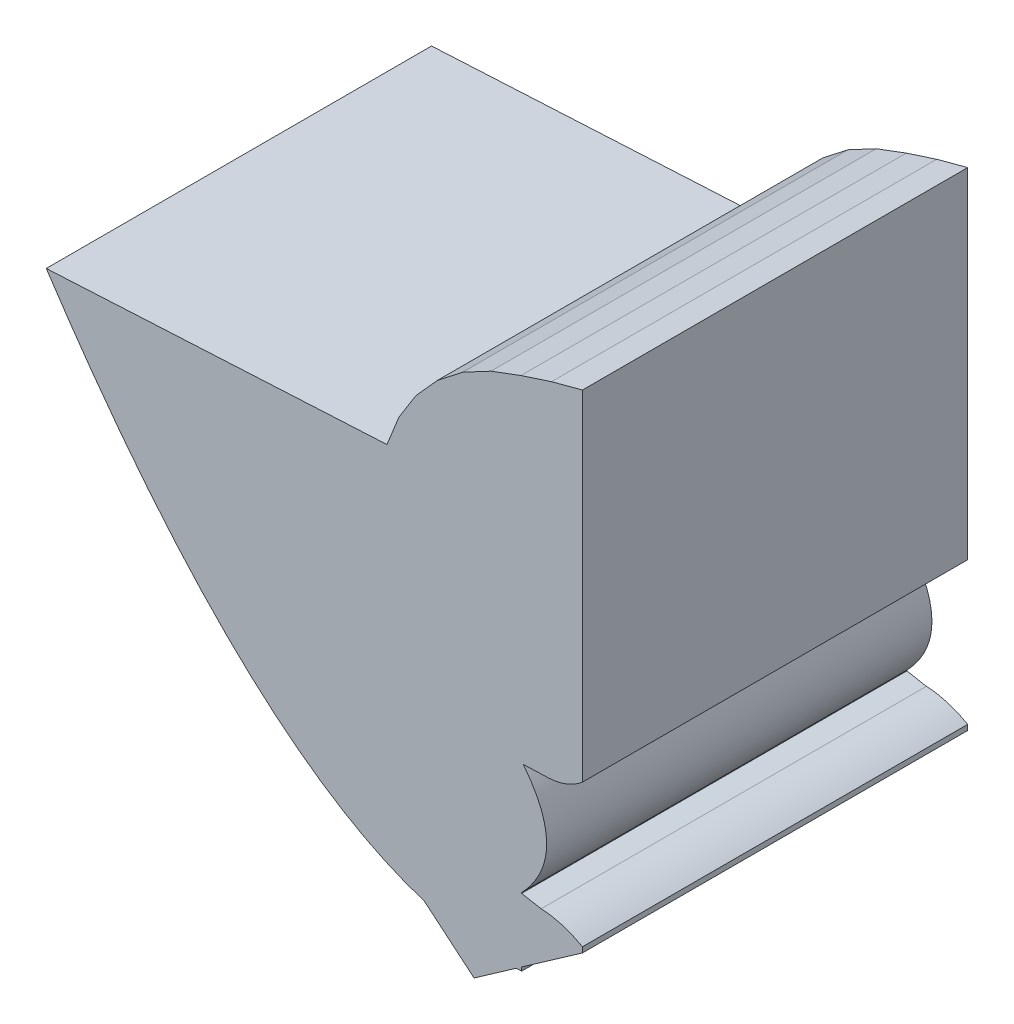
ISO-10303-21;
HEADER;
FILE_DESCRIPTION(('STEP AP214'),'2;1');
FILE_NAME('part.step','',(''),(''),'','','');
FILE_SCHEMA(('AUTOMOTIVE_DESIGN { 1 0 10303 214 1 1 1 1 }'));
ENDSEC;
DATA;
#1=APPLICATION_CONTEXT('core data for automotive mechanical design processes');
#2=APPLICATION_PROTOCOL_DEFINITION('international standard','automotive_design',2000,#1);
#3=PRODUCT_CONTEXT('',#1,'mechanical');
#4=PRODUCT('Part','Part','',(#3));
#5=PRODUCT_RELATED_PRODUCT_CATEGORY('part','',(#4));
#6=PRODUCT_DEFINITION_FORMATION('','',#4);
#7=PRODUCT_DEFINITION_CONTEXT('part definition',#1,'design');
#8=PRODUCT_DEFINITION('design','',#6,#7);
#9=PRODUCT_DEFINITION_SHAPE('','',#8);
#10=(LENGTH_UNIT() NAMED_UNIT(*) SI_UNIT(.MILLI.,.METRE.));
#11=(NAMED_UNIT(*) PLANE_ANGLE_UNIT() SI_UNIT($,.RADIAN.));
#12=(NAMED_UNIT(*) SI_UNIT($,.STERADIAN.) SOLID_ANGLE_UNIT());
#13=UNCERTAINTY_MEASURE_WITH_UNIT(LENGTH_MEASURE(1.E-05),#10,'distance_accuracy_value','');
#14=(GEOMETRIC_REPRESENTATION_CONTEXT(3) GLOBAL_UNCERTAINTY_ASSIGNED_CONTEXT((#13)) GLOBAL_UNIT_ASSIGNED_CONTEXT((#10,
#11,#12)) REPRESENTATION_CONTEXT('',''));
#15=CARTESIAN_POINT('',(0.,0.,0.));
#16=DIRECTION('',(0.,0.,1.));
#17=DIRECTION('',(1.,0.,0.));
#18=AXIS2_PLACEMENT_3D('',#15,#16,#17);
#19=CARTESIAN_POINT('',(-2.17733041778456,0.,7.21));
#20=DIRECTION('',(1.,0.,0.));
#21=DIRECTION('',(0.,1.,0.));
#22=AXIS2_PLACEMENT_3D('',#19,#20,#21);
#23=PLANE('',#22);
#24=DIRECTION('',(0.,-1.,0.));
#25=VECTOR('',#24,1.);
#26=CARTESIAN_POINT('',(-2.17733041778456,0.,7.21));
#27=LINE('',#26,#25);
#28=CARTESIAN_POINT('',(-2.17733041782181,-1.84042057234379,7.21));
#29=VERTEX_POINT('',#28);
#30=CARTESIAN_POINT('',(-2.17733041778456,-1.86563836372951,7.21));
#31=VERTEX_POINT('',#30);
#32=EDGE_CURVE('E396',#29,#31,#27,.T.);
#33=ORIENTED_EDGE('',*,*,#32,.T.);
#34=DIRECTION('',(0.,0.,-1.));
#35=VECTOR('',#34,1.);
#36=CARTESIAN_POINT('',(-2.17733041778456,-1.86563836372951,7.21));
#37=LINE('',#36,#35);
#38=CARTESIAN_POINT('',(-2.17733041778456,-1.86563836372951,-7.21));
#39=VERTEX_POINT('',#38);
#40=EDGE_CURVE('E13',#31,#39,#37,.T.);
#41=ORIENTED_EDGE('',*,*,#40,.T.);
#42=DIRECTION('',(0.,-1.,0.));
#43=VECTOR('',#42,1.);
#44=CARTESIAN_POINT('',(-2.17733041778456,0.,-7.21));
#45=LINE('',#44,#43);
#46=CARTESIAN_POINT('',(-2.17733041778456,-1.84042057230949,-7.21));
#47=VERTEX_POINT('',#46);
#48=EDGE_CURVE('E216',#47,#39,#45,.T.);
#49=ORIENTED_EDGE('',*,*,#48,.F.);
#50=DIRECTION('',(0.,0.,-1.));
#51=VECTOR('',#50,1.);
#52=CARTESIAN_POINT('',(-2.1773304177975,-1.84042057234945,31.0131303069921));
#53=LINE('',#52,#51);
#54=EDGE_CURVE('E347',#29,#47,#53,.T.);
#55=ORIENTED_EDGE('',*,*,#54,.F.);
#56=EDGE_LOOP('',(#33,#41,#49,#55));
#57=FACE_BOUND('',#56,.T.);
#58=ADVANCED_FACE('F60',(#57),#23,.T.);
#59=CARTESIAN_POINT('',(-2.17733041778456,-4.25341499115567,-7.21));
#60=VERTEX_POINT('',#59);
#61=CARTESIAN_POINT('',(-2.17733041780588,-4.38828202201243,-7.21));
#62=VERTEX_POINT('',#61);
#63=EDGE_CURVE('E336',#60,#62,#45,.T.);
#64=ORIENTED_EDGE('',*,*,#63,.F.);
#65=DIRECTION('',(0.,0.,1.));
#66=VECTOR('',#65,1.);
#67=CARTESIAN_POINT('',(-2.17733041778456,-4.25341499115567,7.21));
#68=LINE('',#67,#66);
#69=CARTESIAN_POINT('',(-2.17733041778456,-4.25341499115567,7.21));
#70=VERTEX_POINT('',#69);
#71=EDGE_CURVE('E247',#60,#70,#68,.T.);
#72=ORIENTED_EDGE('',*,*,#71,.T.);
#73=CARTESIAN_POINT('',(-2.17733041779078,-4.38828202201243,7.21));
#74=VERTEX_POINT('',#73);
#75=EDGE_CURVE('E398',#70,#74,#27,.T.);
#76=ORIENTED_EDGE('',*,*,#75,.T.);
#77=DIRECTION('',(0.,0.,1.));
#78=VECTOR('',#77,1.);
#79=CARTESIAN_POINT('',(-2.17733041780588,-4.38828202201243,-7.21));
#80=LINE('',#79,#78);
#81=EDGE_CURVE('E309',#62,#74,#80,.T.);
#82=ORIENTED_EDGE('',*,*,#81,.F.);
#83=EDGE_LOOP('',(#64,#72,#76,#82));
#84=FACE_BOUND('',#83,.T.);
#85=ADVANCED_FACE('F367',(#84),#23,.T.);
#86=CARTESIAN_POINT('',(-82931.2998220372,996560.090302793,31.0131303069921));
#87=CARTESIAN_POINT('',(87153.6895148631,-996199.076380996,31.0131303069921));
#88=CARTESIAN_POINT('',(-91384.2921388704,995820.549302198,31.0131303069921));
#89=B_SPLINE_CURVE_WITH_KNOTS('',2,(#86,#87,#88),.UNSPECIFIED.,.F.,.F.,(3,3),(0.,1.),.UNSPECIFIED.);
#90=DIRECTION('',(0.,0.,-1.));
#91=VECTOR('',#90,1.);
#92=SURFACE_OF_LINEAR_EXTRUSION('',#89,#91);
#93=CARTESIAN_POINT('',(-82931.2998220372,996560.090302793,-7.21));
#94=CARTESIAN_POINT('',(87153.6895148631,-996199.076380996,-7.21));
#95=CARTESIAN_POINT('',(-91384.2921388704,995820.549302198,-7.21));
#96=B_SPLINE_CURVE_WITH_KNOTS('',2,(#93,#94,#95),.UNSPECIFIED.,.F.,.F.,(3,3),(0.,1.),.UNSPECIFIED.);
#97=CARTESIAN_POINT('',(-19.969359013593,9.49376503209276,-7.21));
#98=VERTEX_POINT('',#97);
#99=CARTESIAN_POINT('',(-5.81761685091845,-3.9392926951686,-7.21));
#100=VERTEX_POINT('',#99);
#101=EDGE_CURVE('E323',#98,#100,#96,.F.);
#102=ORIENTED_EDGE('',*,*,#101,.T.);
#103=DIRECTION('',(0.,0.,-1.));
#104=VECTOR('',#103,1.);
#105=CARTESIAN_POINT('',(-5.8176168506292,-3.939292695462,0.));
#106=LINE('',#105,#104);
#107=CARTESIAN_POINT('',(-5.81761685090827,-3.93929269517714,7.21));
#108=VERTEX_POINT('',#107);
#109=EDGE_CURVE('E64',#100,#108,#106,.F.);
#110=ORIENTED_EDGE('',*,*,#109,.T.);
#111=CARTESIAN_POINT('',(-82931.2998220372,996560.090302793,7.21));
#112=CARTESIAN_POINT('',(87153.6895148631,-996199.076380996,7.21));
#113=CARTESIAN_POINT('',(-91384.2921388704,995820.549302198,7.21));
#114=B_SPLINE_CURVE_WITH_KNOTS('',2,(#111,#112,#113),.UNSPECIFIED.,.F.,.F.,(3,3),(0.,1.),.UNSPECIFIED.);
#115=CARTESIAN_POINT('',(-19.969359013593,9.49376503209276,7.21));
#116=VERTEX_POINT('',#115);
#117=EDGE_CURVE('E339',#108,#116,#114,.T.);
#118=ORIENTED_EDGE('',*,*,#117,.T.);
#119=DIRECTION('',(0.,0.,1.));
#120=VECTOR('',#119,1.);
#121=CARTESIAN_POINT('',(-19.969359013593,9.49376503209276,-7.21));
#122=LINE('',#121,#120);
#123=EDGE_CURVE('E307',#98,#116,#122,.T.);
#124=ORIENTED_EDGE('',*,*,#123,.F.);
#125=EDGE_LOOP('',(#102,#110,#118,#124));
#126=FACE_BOUND('',#125,.T.);
#127=ADVANCED_FACE('F364',(#126),#92,.T.);
#128=CARTESIAN_POINT('',(-2.38857363558244,-4.40132908465364,7.21));
#129=VERTEX_POINT('',#128);
#130=EDGE_CURVE('E327',#74,#129,#114,.T.);
#131=ORIENTED_EDGE('',*,*,#130,.T.);
#132=DIRECTION('',(0.,0.,-1.));
#133=VECTOR('',#132,1.);
#134=CARTESIAN_POINT('',(-2.38857363570211,-4.4013290847312,0.));
#135=LINE('',#134,#133);
#136=CARTESIAN_POINT('',(-2.38857363552891,-4.40132908473009,-7.21));
#137=VERTEX_POINT('',#136);
#138=EDGE_CURVE('E402',#129,#137,#135,.T.);
#139=ORIENTED_EDGE('',*,*,#138,.T.);
#140=EDGE_CURVE('E318',#137,#62,#96,.F.);
#141=ORIENTED_EDGE('',*,*,#140,.T.);
#142=ORIENTED_EDGE('',*,*,#81,.T.);
#143=EDGE_LOOP('',(#131,#139,#141,#142));
#144=FACE_BOUND('',#143,.T.);
#145=ADVANCED_FACE('F368',(#144),#92,.T.);
#146=CARTESIAN_POINT('',(-996004.99942647,89338.2959789018,31.0131303069921));
#147=CARTESIAN_POINT('',(996193.448091746,-87155.7427476542,31.0131303069921));
#148=CARTESIAN_POINT('',(-996386.896757022,84973.1895164066,31.0131303069921));
#149=B_SPLINE_CURVE_WITH_KNOTS('',2,(#146,#147,#148),.UNSPECIFIED.,.F.,.F.,(3,3),(0.,1.),.UNSPECIFIED.);
#150=DIRECTION('',(0.,0.,-1.));
#151=VECTOR('',#150,1.);
#152=SURFACE_OF_LINEAR_EXTRUSION('',#149,#151);
#153=CARTESIAN_POINT('',(-996004.99942647,89338.2959789018,-7.21));
#154=CARTESIAN_POINT('',(996193.448091746,-87155.7427476542,-7.21));
#155=CARTESIAN_POINT('',(-996386.896757022,84973.1895164066,-7.21));
#156=B_SPLINE_CURVE_WITH_KNOTS('',2,(#153,#154,#155),.UNSPECIFIED.,.F.,.F.,(3,3),(0.,1.),.UNSPECIFIED.);
#157=CARTESIAN_POINT('',(-2.11351559802847,2.34471546976612,-7.21));
#158=VERTEX_POINT('',#157);
#159=EDGE_CURVE('E312',#47,#158,#156,.F.);
#160=ORIENTED_EDGE('',*,*,#159,.T.);
#161=DIRECTION('',(0.,0.,-1.));
#162=VECTOR('',#161,1.);
#163=CARTESIAN_POINT('',(-2.11351560817419,2.34471546941195,0.));
#164=LINE('',#163,#162);
#165=CARTESIAN_POINT('',(-2.11351559755463,2.34471545592907,7.21));
#166=VERTEX_POINT('',#165);
#167=EDGE_CURVE('E397',#158,#166,#164,.F.);
#168=ORIENTED_EDGE('',*,*,#167,.T.);
#169=CARTESIAN_POINT('',(-996004.99942647,89338.2959789018,7.21));
#170=CARTESIAN_POINT('',(996193.448091746,-87155.7427476542,7.21));
#171=CARTESIAN_POINT('',(-996386.896757022,84973.1895164066,7.21));
#172=B_SPLINE_CURVE_WITH_KNOTS('',2,(#169,#170,#171),.UNSPECIFIED.,.F.,.F.,(3,3),(0.,1.),.UNSPECIFIED.);
#173=EDGE_CURVE('E328',#166,#29,#172,.T.);
#174=ORIENTED_EDGE('',*,*,#173,.T.);
#175=ORIENTED_EDGE('',*,*,#54,.T.);
#176=EDGE_LOOP('',(#160,#168,#174,#175));
#177=FACE_BOUND('',#176,.T.);
#178=ADVANCED_FACE('F373',(#177),#152,.T.);
#179=CARTESIAN_POINT('',(0.,0.,7.21));
#180=DIRECTION('',(0.,0.,1.));
#181=DIRECTION('',(1.,0.,0.));
#182=AXIS2_PLACEMENT_3D('',#179,#180,#181);
#183=PLANE('',#182);
#184=ORIENTED_EDGE('',*,*,#75,.F.);
#185=DIRECTION('',(0.819152044288593,0.573576436351615,0.));
#186=VECTOR('',#185,1.);
#187=CARTESIAN_POINT('',(0.100000000004221,-2.65881106562334,7.21));
#188=LINE('',#187,#186);
#189=CARTESIAN_POINT('',(0.100000000004221,-2.65881106562334,7.21));
#190=VERTEX_POINT('',#189);
#191=EDGE_CURVE('E71',#70,#190,#188,.T.);
#192=ORIENTED_EDGE('',*,*,#191,.T.);
#193=DIRECTION('',(-1.62011653008151E-11,1.,0.));
#194=VECTOR('',#193,1.);
#195=CARTESIAN_POINT('',(0.100000000000981,-2.45881106562334,7.21));
#196=LINE('',#195,#194);
#197=CARTESIAN_POINT('',(0.100000000000981,-2.45881106562334,7.21));
#198=VERTEX_POINT('',#197);
#199=EDGE_CURVE('E258',#190,#198,#196,.T.);
#200=ORIENTED_EDGE('',*,*,#199,.T.);
#201=CARTESIAN_POINT('',(-15004.7897636461,-999892.444646946,7.21));
#202=CARTESIAN_POINT('',(17450.906437277,999845.695156391,7.21));
#203=CARTESIAN_POINT('',(-19903.023110908,-999806.945665836,7.21));
#204=B_SPLINE_CURVE_WITH_KNOTS('',2,(#201,#202,#203),.UNSPECIFIED.,.F.,.F.,(3,3),(0.,1.),.UNSPECIFIED.);
#205=CARTESIAN_POINT('',(-1.44765075676889,-2.00137084805176,7.21));
#206=VERTEX_POINT('',#205);
#207=EDGE_CURVE('E255',#198,#206,#204,.T.);
#208=ORIENTED_EDGE('',*,*,#207,.T.);
#209=DIRECTION('',(-0.983135348114243,0.182879433748812,0.));
#210=VECTOR('',#209,1.);
#211=CARTESIAN_POINT('',(-1.44765075676889,-2.00137084805176,7.21));
#212=LINE('',#211,#210);
#213=EDGE_CURVE('E227',#206,#31,#212,.T.);
#214=ORIENTED_EDGE('',*,*,#213,.T.);
#215=ORIENTED_EDGE('',*,*,#32,.F.);
#216=ORIENTED_EDGE('',*,*,#173,.F.);
#217=DIRECTION('',(0.999390827019096,0.0348994967025048,0.));
#218=VECTOR('',#217,1.);
#219=CARTESIAN_POINT('',(-2.17733041778456,2.34248700715526,7.21));
#220=LINE('',#219,#218);
#221=CARTESIAN_POINT('',(-1.19050164048462,2.37694782742692,7.21000000000002));
#222=VERTEX_POINT('',#221);
#223=EDGE_CURVE('E501',#166,#222,#220,.T.);
#224=ORIENTED_EDGE('',*,*,#223,.T.);
#225=CARTESIAN_POINT('',(-343900.072311573,939011.080499257,7.21000000000001));
#226=CARTESIAN_POINT('',(342019.599581338,-939690.120785908,7.21000000000001));
#227=CARTESIAN_POINT('',(-340141.301828429,940379.16107256,7.21000000000001));
#228=B_SPLINE_CURVE_WITH_KNOTS('',2,(#225,#226,#227),.UNSPECIFIED.,.F.,.F.,(3,3),(0.,1.),.UNSPECIFIED.);
#229=CARTESIAN_POINT('',(0.100000000004221,2.87767341815847,7.21000000000001));
#230=VERTEX_POINT('',#229);
#231=EDGE_CURVE('E306',#222,#230,#228,.T.);
#232=ORIENTED_EDGE('',*,*,#231,.T.);
#233=DIRECTION('',(0.,1.,0.));
#234=VECTOR('',#233,1.);
#235=CARTESIAN_POINT('',(0.100000000004221,2.87767341815847,7.21));
#236=LINE('',#235,#234);
#237=CARTESIAN_POINT('',(0.100000000004747,15.587903347272,7.21));
#238=VERTEX_POINT('',#237);
#239=EDGE_CURVE('E433',#230,#238,#236,.T.);
#240=ORIENTED_EDGE('',*,*,#239,.T.);
#241=DIRECTION('',(-0.96592582628907,-0.258819045102515,0.));
#242=VECTOR('',#241,1.);
#243=CARTESIAN_POINT('',(-1.05911099154214,15.277320493149,7.21));
#244=LINE('',#243,#242);
#245=CARTESIAN_POINT('',(-1.05911099154214,15.277320493149,7.21000000000001));
#246=VERTEX_POINT('',#245);
#247=EDGE_CURVE('E438',#238,#246,#244,.T.);
#248=ORIENTED_EDGE('',*,*,#247,.T.);
#249=DIRECTION('',(-0.951056516295155,-0.309016994374943,0.));
#250=VECTOR('',#249,1.);
#251=CARTESIAN_POINT('',(-2.20037881109632,14.906500099899,7.21));
#252=LINE('',#251,#250);
#253=CARTESIAN_POINT('',(-2.20037881109632,14.906500099899,7.21000000000001));
#254=VERTEX_POINT('',#253);
#255=EDGE_CURVE('E445',#246,#254,#252,.T.);
#256=ORIENTED_EDGE('',*,*,#255,.T.);
#257=DIRECTION('',(-0.9366721892484,-0.350207381259461,0.));
#258=VECTOR('',#257,1.);
#259=CARTESIAN_POINT('',(-3.3243854381944,14.4862512423877,7.21));
#260=LINE('',#259,#258);
#261=CARTESIAN_POINT('',(-3.3243854381944,14.4862512423877,7.21000000000001));
#262=VERTEX_POINT('',#261);
#263=EDGE_CURVE('E518',#254,#262,#260,.T.);
#264=ORIENTED_EDGE('',*,*,#263,.T.);
#265=DIRECTION('',(-0.882947592859007,-0.46947156278574,0.));
#266=VECTOR('',#265,1.);
#267=CARTESIAN_POINT('',(-4.38392254962521,13.9228853670448,7.21));
#268=LINE('',#267,#266);
#269=CARTESIAN_POINT('',(-4.38392254962521,13.9228853670448,7.21000000000001));
#270=VERTEX_POINT('',#269);
#271=EDGE_CURVE('E514',#262,#270,#268,.T.);
#272=ORIENTED_EDGE('',*,*,#271,.T.);
#273=DIRECTION('',(-0.788010753606726,-0.615661475325654,0.));
#274=VECTOR('',#273,1.);
#275=CARTESIAN_POINT('',(-5.32953545395328,13.184091596654,7.21));
#276=LINE('',#275,#274);
#277=CARTESIAN_POINT('',(-5.32953545395328,13.184091596654,7.21000000000001));
#278=VERTEX_POINT('',#277);
#279=EDGE_CURVE('E509',#270,#278,#276,.T.);
#280=ORIENTED_EDGE('',*,*,#279,.T.);
#281=DIRECTION('',(-0.669130606358526,-0.743144825477694,0.));
#282=VECTOR('',#281,1.);
#283=CARTESIAN_POINT('',(-6.13249218158351,12.2923178060808,7.21));
#284=LINE('',#283,#282);
#285=CARTESIAN_POINT('',(-6.13249218158351,12.2923178060808,7.21000000000001));
#286=VERTEX_POINT('',#285);
#287=EDGE_CURVE('E507',#278,#286,#284,.T.);
#288=ORIENTED_EDGE('',*,*,#287,.T.);
#289=DIRECTION('',(-0.52991926423321,-0.848048096156423,0.));
#290=VECTOR('',#289,1.);
#291=CARTESIAN_POINT('',(-6.76839529866336,11.2746600906931,7.21));
#292=LINE('',#291,#290);
#293=CARTESIAN_POINT('',(-6.76839529866336,11.2746600906931,7.21000000000001));
#294=VERTEX_POINT('',#293);
#295=EDGE_CURVE('E461',#286,#294,#292,.T.);
#296=ORIENTED_EDGE('',*,*,#295,.T.);
#297=DIRECTION('',(-0.374606593415918,-0.927183854566785,0.));
#298=VECTOR('',#297,1.);
#299=CARTESIAN_POINT('',(-7.21792321076246,10.1620394652129,7.21));
#300=LINE('',#299,#298);
#301=CARTESIAN_POINT('',(-7.21792321076246,10.1620394652129,7.21000000000001));
#302=VERTEX_POINT('',#301);
#303=EDGE_CURVE('E413',#294,#302,#300,.T.);
#304=ORIENTED_EDGE('',*,*,#303,.T.);
#305=DIRECTION('',(-0.998629534754472,-0.0523359562448839,0.));
#306=VECTOR('',#305,1.);
#307=CARTESIAN_POINT('',(-19.969359013593,9.49376503209276,7.21));
#308=LINE('',#307,#306);
#309=EDGE_CURVE('E299',#302,#116,#308,.T.);
#310=ORIENTED_EDGE('',*,*,#309,.T.);
#311=ORIENTED_EDGE('',*,*,#117,.F.);
#312=DIRECTION('',(0.766044443118984,-0.642787609686532,0.));
#313=VECTOR('',#312,1.);
#314=CARTESIAN_POINT('',(-10.029650264515,-0.404977011313413,7.21));
#315=LINE('',#314,#313);
#316=CARTESIAN_POINT('',(-3.95763831339756,-5.5,7.21));
#317=VERTEX_POINT('',#316);
#318=EDGE_CURVE('E248',#108,#317,#315,.T.);
#319=ORIENTED_EDGE('',*,*,#318,.T.);
#320=EDGE_CURVE('E244',#317,#129,#188,.T.);
#321=ORIENTED_EDGE('',*,*,#320,.T.);
#322=ORIENTED_EDGE('',*,*,#130,.F.);
#323=EDGE_LOOP('',(#184,#192,#200,#208,#214,#215,#216,#224,#232,#240,#248,#256,#264,#272,#280,
#288,#296,#304,#310,#311,#319,#321,#322));
#324=FACE_BOUND('',#323,.T.);
#325=ADVANCED_FACE('F376',(#324),#183,.T.);
#326=CARTESIAN_POINT('',(0.,0.,-7.21));
#327=DIRECTION('',(0.,0.,1.));
#328=DIRECTION('',(1.,0.,0.));
#329=AXIS2_PLACEMENT_3D('',#326,#327,#328);
#330=PLANE('',#329);
#331=ORIENTED_EDGE('',*,*,#48,.T.);
#332=DIRECTION('',(0.983135348114243,-0.182879433748812,0.));
#333=VECTOR('',#332,1.);
#334=CARTESIAN_POINT('',(-1.44765075676889,-2.00137084805176,-7.21));
#335=LINE('',#334,#333);
#336=CARTESIAN_POINT('',(-1.44765075676889,-2.00137084805176,-7.21));
#337=VERTEX_POINT('',#336);
#338=EDGE_CURVE('E213',#39,#337,#335,.T.);
#339=ORIENTED_EDGE('',*,*,#338,.T.);
#340=CARTESIAN_POINT('',(-15004.7897636461,-999892.444646946,-7.21));
#341=CARTESIAN_POINT('',(17450.906437277,999845.695156391,-7.21));
#342=CARTESIAN_POINT('',(-19903.023110908,-999806.945665836,-7.21));
#343=B_SPLINE_CURVE_WITH_KNOTS('',2,(#340,#341,#342),.UNSPECIFIED.,.F.,.F.,(3,3),(0.,1.),.UNSPECIFIED.);
#344=CARTESIAN_POINT('',(0.100000000000981,-2.45881106562334,-7.21));
#345=VERTEX_POINT('',#344);
#346=EDGE_CURVE('E217',#337,#345,#343,.F.);
#347=ORIENTED_EDGE('',*,*,#346,.T.);
#348=DIRECTION('',(1.62011653008151E-11,-1.,0.));
#349=VECTOR('',#348,1.);
#350=CARTESIAN_POINT('',(0.100000000000981,-2.45881106562334,-7.21));
#351=LINE('',#350,#349);
#352=CARTESIAN_POINT('',(0.100000000004221,-2.65881106562334,-7.21));
#353=VERTEX_POINT('',#352);
#354=EDGE_CURVE('E234',#345,#353,#351,.T.);
#355=ORIENTED_EDGE('',*,*,#354,.T.);
#356=DIRECTION('',(-0.819152044288593,-0.573576436351615,0.));
#357=VECTOR('',#356,1.);
#358=CARTESIAN_POINT('',(0.100000000004221,-2.65881106562334,-7.21));
#359=LINE('',#358,#357);
#360=EDGE_CURVE('E236',#353,#60,#359,.T.);
#361=ORIENTED_EDGE('',*,*,#360,.T.);
#362=ORIENTED_EDGE('',*,*,#63,.T.);
#363=ORIENTED_EDGE('',*,*,#140,.F.);
#364=CARTESIAN_POINT('',(-3.95763831339756,-5.5,-7.21));
#365=VERTEX_POINT('',#364);
#366=EDGE_CURVE('E79',#137,#365,#359,.T.);
#367=ORIENTED_EDGE('',*,*,#366,.T.);
#368=DIRECTION('',(-0.766044443118984,0.642787609686532,0.));
#369=VECTOR('',#368,1.);
#370=CARTESIAN_POINT('',(-10.029650264515,-0.404977011313413,-7.21));
#371=LINE('',#370,#369);
#372=EDGE_CURVE('E709',#365,#100,#371,.T.);
#373=ORIENTED_EDGE('',*,*,#372,.T.);
#374=ORIENTED_EDGE('',*,*,#101,.F.);
#375=DIRECTION('',(-0.998629534754472,-0.0523359562448839,0.));
#376=VECTOR('',#375,1.);
#377=CARTESIAN_POINT('',(-19.969359013593,9.49376503209276,-7.21));
#378=LINE('',#377,#376);
#379=CARTESIAN_POINT('',(-7.21792321076246,10.1620394652129,-7.21));
#380=VERTEX_POINT('',#379);
#381=EDGE_CURVE('E304',#380,#98,#378,.T.);
#382=ORIENTED_EDGE('',*,*,#381,.F.);
#383=DIRECTION('',(0.374606593415918,0.927183854566785,0.));
#384=VECTOR('',#383,1.);
#385=CARTESIAN_POINT('',(-7.21792321076246,10.1620394652129,-7.21));
#386=LINE('',#385,#384);
#387=CARTESIAN_POINT('',(-6.76839529866336,11.2746600906931,-7.21));
#388=VERTEX_POINT('',#387);
#389=EDGE_CURVE('E425',#380,#388,#386,.T.);
#390=ORIENTED_EDGE('',*,*,#389,.T.);
#391=DIRECTION('',(0.52991926423321,0.848048096156423,0.));
#392=VECTOR('',#391,1.);
#393=CARTESIAN_POINT('',(-6.76839529866336,11.2746600906931,-7.21));
#394=LINE('',#393,#392);
#395=CARTESIAN_POINT('',(-6.13249218158351,12.2923178060808,-7.21));
#396=VERTEX_POINT('',#395);
#397=EDGE_CURVE('E457',#388,#396,#394,.T.);
#398=ORIENTED_EDGE('',*,*,#397,.T.);
#399=DIRECTION('',(0.669130606358526,0.743144825477694,0.));
#400=VECTOR('',#399,1.);
#401=CARTESIAN_POINT('',(-6.13249218158351,12.2923178060808,-7.21));
#402=LINE('',#401,#400);
#403=CARTESIAN_POINT('',(-5.32953545395328,13.184091596654,-7.21));
#404=VERTEX_POINT('',#403);
#405=EDGE_CURVE('E470',#396,#404,#402,.T.);
#406=ORIENTED_EDGE('',*,*,#405,.T.);
#407=DIRECTION('',(0.788010753606726,0.615661475325654,0.));
#408=VECTOR('',#407,1.);
#409=CARTESIAN_POINT('',(-5.32953545395328,13.184091596654,-7.21));
#410=LINE('',#409,#408);
#411=CARTESIAN_POINT('',(-4.38392254962521,13.9228853670448,-7.21));
#412=VERTEX_POINT('',#411);
#413=EDGE_CURVE('E475',#404,#412,#410,.T.);
#414=ORIENTED_EDGE('',*,*,#413,.T.);
#415=DIRECTION('',(0.882947592859007,0.46947156278574,0.));
#416=VECTOR('',#415,1.);
#417=CARTESIAN_POINT('',(-4.38392254962521,13.9228853670448,-7.21));
#418=LINE('',#417,#416);
#419=CARTESIAN_POINT('',(-3.3243854381944,14.4862512423877,-7.21));
#420=VERTEX_POINT('',#419);
#421=EDGE_CURVE('E474',#412,#420,#418,.T.);
#422=ORIENTED_EDGE('',*,*,#421,.T.);
#423=DIRECTION('',(0.9366721892484,0.350207381259461,0.));
#424=VECTOR('',#423,1.);
#425=CARTESIAN_POINT('',(-3.3243854381944,14.4862512423877,-7.21));
#426=LINE('',#425,#424);
#427=CARTESIAN_POINT('',(-2.20037881109632,14.906500099899,-7.21000000000001));
#428=VERTEX_POINT('',#427);
#429=EDGE_CURVE('E714',#420,#428,#426,.T.);
#430=ORIENTED_EDGE('',*,*,#429,.T.);
#431=DIRECTION('',(0.951056516295155,0.309016994374943,0.));
#432=VECTOR('',#431,1.);
#433=CARTESIAN_POINT('',(-2.20037881109632,14.906500099899,-7.21));
#434=LINE('',#433,#432);
#435=CARTESIAN_POINT('',(-1.05911099154214,15.277320493149,-7.21));
#436=VERTEX_POINT('',#435);
#437=EDGE_CURVE('E492',#428,#436,#434,.T.);
#438=ORIENTED_EDGE('',*,*,#437,.T.);
#439=DIRECTION('',(0.96592582628907,0.258819045102515,0.));
#440=VECTOR('',#439,1.);
#441=CARTESIAN_POINT('',(-1.05911099154214,15.277320493149,-7.21));
#442=LINE('',#441,#440);
#443=CARTESIAN_POINT('',(0.100000000004747,15.587903347272,-7.21));
#444=VERTEX_POINT('',#443);
#445=EDGE_CURVE('E495',#436,#444,#442,.T.);
#446=ORIENTED_EDGE('',*,*,#445,.T.);
#447=DIRECTION('',(0.,-1.,0.));
#448=VECTOR('',#447,1.);
#449=CARTESIAN_POINT('',(0.100000000004221,2.87767341815847,-7.21));
#450=LINE('',#449,#448);
#451=CARTESIAN_POINT('',(0.0999999999995449,2.8776734181557,-7.21000000000001));
#452=VERTEX_POINT('',#451);
#453=EDGE_CURVE('E487',#444,#452,#450,.T.);
#454=ORIENTED_EDGE('',*,*,#453,.T.);
#455=CARTESIAN_POINT('',(-343900.072311573,939011.080499257,-7.21000000000001));
#456=CARTESIAN_POINT('',(342019.599581338,-939690.120785908,-7.21000000000001));
#457=CARTESIAN_POINT('',(-340141.301828429,940379.16107256,-7.21000000000001));
#458=B_SPLINE_CURVE_WITH_KNOTS('',2,(#455,#456,#457),.UNSPECIFIED.,.F.,.F.,(3,3),(0.,1.),.UNSPECIFIED.);
#459=CARTESIAN_POINT('',(-1.19050164048462,2.37694782741517,-7.21));
#460=VERTEX_POINT('',#459);
#461=EDGE_CURVE('E484',#452,#460,#458,.F.);
#462=ORIENTED_EDGE('',*,*,#461,.T.);
#463=DIRECTION('',(-0.999390827019096,-0.0348994967025048,0.));
#464=VECTOR('',#463,1.);
#465=CARTESIAN_POINT('',(-2.17733041778456,2.34248700715526,-7.21));
#466=LINE('',#465,#464);
#467=EDGE_CURVE('E476',#460,#158,#466,.T.);
#468=ORIENTED_EDGE('',*,*,#467,.T.);
#469=ORIENTED_EDGE('',*,*,#159,.F.);
#470=EDGE_LOOP('',(#331,#339,#347,#355,#361,#362,#363,#367,#373,#374,#382,#390,#398,#406,#414,
#422,#430,#438,#446,#454,#462,#468,#469));
#471=FACE_BOUND('',#470,.T.);
#472=ADVANCED_FACE('F211',(#471),#330,.F.);
#473=CARTESIAN_POINT('',(-19.969359013593,9.49376503209276,-7.21));
#474=DIRECTION('',(-0.0523359562448839,0.998629534754472,0.));
#475=DIRECTION('',(-0.998629534754472,-0.0523359562448839,0.));
#476=AXIS2_PLACEMENT_3D('',#473,#474,#475);
#477=PLANE('',#476);
#478=ORIENTED_EDGE('',*,*,#309,.F.);
#479=DIRECTION('',(0.,0.,-1.));
#480=VECTOR('',#479,1.);
#481=CARTESIAN_POINT('',(-7.21792321076246,10.1620394652129,24.0565253000013));
#482=LINE('',#481,#480);
#483=EDGE_CURVE('E417',#302,#380,#482,.T.);
#484=ORIENTED_EDGE('',*,*,#483,.T.);
#485=ORIENTED_EDGE('',*,*,#381,.T.);
#486=ORIENTED_EDGE('',*,*,#123,.T.);
#487=EDGE_LOOP('',(#478,#484,#485,#486));
#488=FACE_BOUND('',#487,.T.);
#489=ADVANCED_FACE('F371',(#488),#477,.T.);
#490=CARTESIAN_POINT('',(-1.05911099154214,15.277320493149,24.0565253000013));
#491=DIRECTION('',(0.258819045102515,-0.96592582628907,0.));
#492=DIRECTION('',(0.96592582628907,0.258819045102515,0.));
#493=AXIS2_PLACEMENT_3D('',#490,#491,#492);
#494=PLANE('',#493);
#495=ORIENTED_EDGE('',*,*,#247,.F.);
#496=DIRECTION('',(0.,0.,-1.));
#497=VECTOR('',#496,1.);
#498=CARTESIAN_POINT('',(0.100000000004747,15.587903347272,24.0565253000013));
#499=LINE('',#498,#497);
#500=EDGE_CURVE('E300',#238,#444,#499,.T.);
#501=ORIENTED_EDGE('',*,*,#500,.T.);
#502=ORIENTED_EDGE('',*,*,#445,.F.);
#503=DIRECTION('',(0.,0.,-1.));
#504=VECTOR('',#503,1.);
#505=CARTESIAN_POINT('',(-1.05911099154214,15.277320493149,24.0565253000013));
#506=LINE('',#505,#504);
#507=EDGE_CURVE('E447',#246,#436,#506,.T.);
#508=ORIENTED_EDGE('',*,*,#507,.F.);
#509=EDGE_LOOP('',(#495,#501,#502,#508));
#510=FACE_BOUND('',#509,.T.);
#511=ADVANCED_FACE('F383',(#510),#494,.F.);
#512=CARTESIAN_POINT('',(-2.20037881109632,14.906500099899,24.0565253000013));
#513=DIRECTION('',(0.309016994374943,-0.951056516295155,0.));
#514=DIRECTION('',(0.951056516295155,0.309016994374943,0.));
#515=AXIS2_PLACEMENT_3D('',#512,#513,#514);
#516=PLANE('',#515);
#517=ORIENTED_EDGE('',*,*,#255,.F.);
#518=ORIENTED_EDGE('',*,*,#507,.T.);
#519=ORIENTED_EDGE('',*,*,#437,.F.);
#520=DIRECTION('',(0.,0.,-1.));
#521=VECTOR('',#520,1.);
#522=CARTESIAN_POINT('',(-2.20037881109632,14.906500099899,24.0565253000013));
#523=LINE('',#522,#521);
#524=EDGE_CURVE('E449',#254,#428,#523,.T.);
#525=ORIENTED_EDGE('',*,*,#524,.F.);
#526=EDGE_LOOP('',(#517,#518,#519,#525));
#527=FACE_BOUND('',#526,.T.);
#528=ADVANCED_FACE('F525',(#527),#516,.F.);
#529=CARTESIAN_POINT('',(-3.3243854381944,14.4862512423877,24.0565253000013));
#530=DIRECTION('',(0.350207381259461,-0.9366721892484,0.));
#531=DIRECTION('',(0.9366721892484,0.350207381259461,0.));
#532=AXIS2_PLACEMENT_3D('',#529,#530,#531);
#533=PLANE('',#532);
#534=ORIENTED_EDGE('',*,*,#263,.F.);
#535=ORIENTED_EDGE('',*,*,#524,.T.);
#536=ORIENTED_EDGE('',*,*,#429,.F.);
#537=DIRECTION('',(0.,0.,-1.));
#538=VECTOR('',#537,1.);
#539=CARTESIAN_POINT('',(-3.3243854381944,14.4862512423877,24.0565253000013));
#540=LINE('',#539,#538);
#541=EDGE_CURVE('E448',#262,#420,#540,.T.);
#542=ORIENTED_EDGE('',*,*,#541,.F.);
#543=EDGE_LOOP('',(#534,#535,#536,#542));
#544=FACE_BOUND('',#543,.T.);
#545=ADVANCED_FACE('F553',(#544),#533,.F.);
#546=CARTESIAN_POINT('',(-4.38392254962521,13.9228853670448,24.0565253000013));
#547=DIRECTION('',(0.46947156278574,-0.882947592859007,0.));
#548=DIRECTION('',(0.882947592859007,0.46947156278574,0.));
#549=AXIS2_PLACEMENT_3D('',#546,#547,#548);
#550=PLANE('',#549);
#551=ORIENTED_EDGE('',*,*,#271,.F.);
#552=ORIENTED_EDGE('',*,*,#541,.T.);
#553=ORIENTED_EDGE('',*,*,#421,.F.);
#554=DIRECTION('',(0.,0.,-1.));
#555=VECTOR('',#554,1.);
#556=CARTESIAN_POINT('',(-4.38392254962521,13.9228853670448,24.0565253000013));
#557=LINE('',#556,#555);
#558=EDGE_CURVE('E455',#270,#412,#557,.T.);
#559=ORIENTED_EDGE('',*,*,#558,.F.);
#560=EDGE_LOOP('',(#551,#552,#553,#559));
#561=FACE_BOUND('',#560,.T.);
#562=ADVANCED_FACE('F549',(#561),#550,.F.);
#563=CARTESIAN_POINT('',(-5.32953545395328,13.184091596654,24.0565253000013));
#564=DIRECTION('',(0.615661475325654,-0.788010753606726,0.));
#565=DIRECTION('',(0.788010753606726,0.615661475325654,0.));
#566=AXIS2_PLACEMENT_3D('',#563,#564,#565);
#567=PLANE('',#566);
#568=ORIENTED_EDGE('',*,*,#279,.F.);
#569=ORIENTED_EDGE('',*,*,#558,.T.);
#570=ORIENTED_EDGE('',*,*,#413,.F.);
#571=DIRECTION('',(0.,0.,-1.));
#572=VECTOR('',#571,1.);
#573=CARTESIAN_POINT('',(-5.32953545395328,13.184091596654,24.0565253000013));
#574=LINE('',#573,#572);
#575=EDGE_CURVE('E454',#278,#404,#574,.T.);
#576=ORIENTED_EDGE('',*,*,#575,.F.);
#577=EDGE_LOOP('',(#568,#569,#570,#576));
#578=FACE_BOUND('',#577,.T.);
#579=ADVANCED_FACE('F541',(#578),#567,.F.);
#580=CARTESIAN_POINT('',(-6.13249218158351,12.2923178060808,24.0565253000013));
#581=DIRECTION('',(0.743144825477693,-0.669130606358526,0.));
#582=DIRECTION('',(0.669130606358526,0.743144825477694,0.));
#583=AXIS2_PLACEMENT_3D('',#580,#581,#582);
#584=PLANE('',#583);
#585=ORIENTED_EDGE('',*,*,#287,.F.);
#586=ORIENTED_EDGE('',*,*,#575,.T.);
#587=ORIENTED_EDGE('',*,*,#405,.F.);
#588=DIRECTION('',(0.,0.,-1.));
#589=VECTOR('',#588,1.);
#590=CARTESIAN_POINT('',(-6.13249218158351,12.2923178060808,24.0565253000013));
#591=LINE('',#590,#589);
#592=EDGE_CURVE('E427',#286,#396,#591,.T.);
#593=ORIENTED_EDGE('',*,*,#592,.F.);
#594=EDGE_LOOP('',(#585,#586,#587,#593));
#595=FACE_BOUND('',#594,.T.);
#596=ADVANCED_FACE('F468',(#595),#584,.F.);
#597=CARTESIAN_POINT('',(-6.76839529866336,11.2746600906931,24.0565253000013));
#598=DIRECTION('',(0.848048096156423,-0.52991926423321,0.));
#599=DIRECTION('',(0.52991926423321,0.848048096156423,0.));
#600=AXIS2_PLACEMENT_3D('',#597,#598,#599);
#601=PLANE('',#600);
#602=ORIENTED_EDGE('',*,*,#295,.F.);
#603=ORIENTED_EDGE('',*,*,#592,.T.);
#604=ORIENTED_EDGE('',*,*,#397,.F.);
#605=DIRECTION('',(0.,0.,-1.));
#606=VECTOR('',#605,1.);
#607=CARTESIAN_POINT('',(-6.76839529866336,11.2746600906931,24.0565253000013));
#608=LINE('',#607,#606);
#609=EDGE_CURVE('E428',#294,#388,#608,.T.);
#610=ORIENTED_EDGE('',*,*,#609,.F.);
#611=EDGE_LOOP('',(#602,#603,#604,#610));
#612=FACE_BOUND('',#611,.T.);
#613=ADVANCED_FACE('F458',(#612),#601,.F.);
#614=CARTESIAN_POINT('',(-7.21792321076246,10.1620394652129,24.0565253000013));
#615=DIRECTION('',(0.927183854566785,-0.374606593415918,0.));
#616=DIRECTION('',(0.374606593415918,0.927183854566785,0.));
#617=AXIS2_PLACEMENT_3D('',#614,#615,#616);
#618=PLANE('',#617);
#619=ORIENTED_EDGE('',*,*,#303,.F.);
#620=ORIENTED_EDGE('',*,*,#609,.T.);
#621=ORIENTED_EDGE('',*,*,#389,.F.);
#622=ORIENTED_EDGE('',*,*,#483,.F.);
#623=EDGE_LOOP('',(#619,#620,#621,#622));
#624=FACE_BOUND('',#623,.T.);
#625=ADVANCED_FACE('F423',(#624),#618,.F.);
#626=CARTESIAN_POINT('',(-2.17733041778456,2.34248700715526,24.0565253000013));
#627=DIRECTION('',(-0.0348994967025048,0.999390827019096,0.));
#628=DIRECTION('',(-0.999390827019096,-0.0348994967025048,0.));
#629=AXIS2_PLACEMENT_3D('',#626,#627,#628);
#630=PLANE('',#629);
#631=ORIENTED_EDGE('',*,*,#167,.F.);
#632=ORIENTED_EDGE('',*,*,#467,.F.);
#633=DIRECTION('',(0.,0.,-1.));
#634=VECTOR('',#633,1.);
#635=CARTESIAN_POINT('',(-1.19050164048462,2.37694782742692,24.0565253000013));
#636=LINE('',#635,#634);
#637=EDGE_CURVE('E424',#222,#460,#636,.T.);
#638=ORIENTED_EDGE('',*,*,#637,.F.);
#639=ORIENTED_EDGE('',*,*,#223,.F.);
#640=EDGE_LOOP('',(#631,#632,#638,#639));
#641=FACE_BOUND('',#640,.T.);
#642=ADVANCED_FACE('F290',(#641),#630,.F.);
#643=CARTESIAN_POINT('',(-343900.072311573,939011.080499257,24.0565253000013));
#644=CARTESIAN_POINT('',(342019.599581338,-939690.120785908,24.0565253000013));
#645=CARTESIAN_POINT('',(-340141.301828429,940379.16107256,24.0565253000013));
#646=B_SPLINE_CURVE_WITH_KNOTS('',2,(#643,#644,#645),.UNSPECIFIED.,.F.,.F.,(3,3),(0.,1.),.UNSPECIFIED.);
#647=DIRECTION('',(0.,0.,-1.));
#648=VECTOR('',#647,1.);
#649=SURFACE_OF_LINEAR_EXTRUSION('',#646,#648);
#650=ORIENTED_EDGE('',*,*,#231,.F.);
#651=ORIENTED_EDGE('',*,*,#637,.T.);
#652=ORIENTED_EDGE('',*,*,#461,.F.);
#653=DIRECTION('',(0.,0.,-1.));
#654=VECTOR('',#653,1.);
#655=CARTESIAN_POINT('',(0.100000000004221,2.87767341815847,24.0565253000013));
#656=LINE('',#655,#654);
#657=EDGE_CURVE('E426',#230,#452,#656,.T.);
#658=ORIENTED_EDGE('',*,*,#657,.F.);
#659=EDGE_LOOP('',(#650,#651,#652,#658));
#660=FACE_BOUND('',#659,.T.);
#661=ADVANCED_FACE('F281',(#660),#649,.F.);
#662=CARTESIAN_POINT('',(0.100000000004221,2.87767341815847,24.0565253000013));
#663=DIRECTION('',(-1.,0.,0.));
#664=DIRECTION('',(0.,-1.,0.));
#665=AXIS2_PLACEMENT_3D('',#662,#663,#664);
#666=PLANE('',#665);
#667=ORIENTED_EDGE('',*,*,#239,.F.);
#668=ORIENTED_EDGE('',*,*,#657,.T.);
#669=ORIENTED_EDGE('',*,*,#453,.F.);
#670=ORIENTED_EDGE('',*,*,#500,.F.);
#671=EDGE_LOOP('',(#667,#668,#669,#670));
#672=FACE_BOUND('',#671,.T.);
#673=ADVANCED_FACE('F277',(#672),#666,.F.);
#674=CARTESIAN_POINT('',(0.100000000004221,-2.65881106562334,18.548830351351));
#675=DIRECTION('',(-0.573576436351615,0.819152044288594,0.));
#676=DIRECTION('',(-0.819152044288593,-0.573576436351615,0.));
#677=AXIS2_PLACEMENT_3D('',#674,#675,#676);
#678=PLANE('',#677);
#679=ORIENTED_EDGE('',*,*,#138,.F.);
#680=ORIENTED_EDGE('',*,*,#320,.F.);
#681=DIRECTION('',(0.,0.,-1.));
#682=VECTOR('',#681,1.);
#683=CARTESIAN_POINT('',(-3.95763831339756,-5.5,18.548830351351));
#684=LINE('',#683,#682);
#685=EDGE_CURVE('E233',#317,#365,#684,.T.);
#686=ORIENTED_EDGE('',*,*,#685,.T.);
#687=ORIENTED_EDGE('',*,*,#366,.F.);
#688=EDGE_LOOP('',(#679,#680,#686,#687));
#689=FACE_BOUND('',#688,.T.);
#690=ADVANCED_FACE('F284',(#689),#678,.F.);
#691=CARTESIAN_POINT('',(-10.029650264515,-0.404977011313413,18.548830351351));
#692=DIRECTION('',(0.642787609686532,0.766044443118984,0.));
#693=DIRECTION('',(-0.766044443118984,0.642787609686532,0.));
#694=AXIS2_PLACEMENT_3D('',#691,#692,#693);
#695=PLANE('',#694);
#696=ORIENTED_EDGE('',*,*,#109,.F.);
#697=ORIENTED_EDGE('',*,*,#372,.F.);
#698=ORIENTED_EDGE('',*,*,#685,.F.);
#699=ORIENTED_EDGE('',*,*,#318,.F.);
#700=EDGE_LOOP('',(#696,#697,#698,#699));
#701=FACE_BOUND('',#700,.T.);
#702=ADVANCED_FACE('F661',(#701),#695,.F.);
#703=ORIENTED_EDGE('',*,*,#71,.F.);
#704=ORIENTED_EDGE('',*,*,#360,.F.);
#705=DIRECTION('',(0.,0.,-1.));
#706=VECTOR('',#705,1.);
#707=CARTESIAN_POINT('',(0.100000000004221,-2.65881106562334,18.548830351351));
#708=LINE('',#707,#706);
#709=EDGE_CURVE('E264',#190,#353,#708,.T.);
#710=ORIENTED_EDGE('',*,*,#709,.F.);
#711=ORIENTED_EDGE('',*,*,#191,.F.);
#712=EDGE_LOOP('',(#703,#704,#710,#711));
#713=FACE_BOUND('',#712,.T.);
#714=ADVANCED_FACE('F276',(#713),#678,.F.);
#715=CARTESIAN_POINT('',(-15004.7897636461,-999892.444646946,18.548830351351));
#716=CARTESIAN_POINT('',(17450.906437277,999845.695156391,18.548830351351));
#717=CARTESIAN_POINT('',(-19903.023110908,-999806.945665836,18.548830351351));
#718=B_SPLINE_CURVE_WITH_KNOTS('',2,(#715,#716,#717),.UNSPECIFIED.,.F.,.F.,(3,3),(0.,1.),.UNSPECIFIED.);
#719=DIRECTION('',(0.,0.,-1.));
#720=VECTOR('',#719,1.);
#721=SURFACE_OF_LINEAR_EXTRUSION('',#718,#720);
#722=ORIENTED_EDGE('',*,*,#207,.F.);
#723=DIRECTION('',(0.,0.,-1.));
#724=VECTOR('',#723,1.);
#725=CARTESIAN_POINT('',(0.100000000000981,-2.45881106562334,18.548830351351));
#726=LINE('',#725,#724);
#727=EDGE_CURVE('E223',#198,#345,#726,.T.);
#728=ORIENTED_EDGE('',*,*,#727,.T.);
#729=ORIENTED_EDGE('',*,*,#346,.F.);
#730=DIRECTION('',(0.,0.,-1.));
#731=VECTOR('',#730,1.);
#732=CARTESIAN_POINT('',(-1.44765075676889,-2.00137084805176,18.548830351351));
#733=LINE('',#732,#731);
#734=EDGE_CURVE('E225',#206,#337,#733,.T.);
#735=ORIENTED_EDGE('',*,*,#734,.F.);
#736=EDGE_LOOP('',(#722,#728,#729,#735));
#737=FACE_BOUND('',#736,.T.);
#738=ADVANCED_FACE('F231',(#737),#721,.F.);
#739=CARTESIAN_POINT('',(-1.44765075676889,-2.00137084805176,18.548830351351));
#740=DIRECTION('',(-0.182879433748812,-0.983135348114243,0.));
#741=DIRECTION('',(0.983135348114243,-0.182879433748812,0.));
#742=AXIS2_PLACEMENT_3D('',#739,#740,#741);
#743=PLANE('',#742);
#744=ORIENTED_EDGE('',*,*,#40,.F.);
#745=ORIENTED_EDGE('',*,*,#213,.F.);
#746=ORIENTED_EDGE('',*,*,#734,.T.);
#747=ORIENTED_EDGE('',*,*,#338,.F.);
#748=EDGE_LOOP('',(#744,#745,#746,#747));
#749=FACE_BOUND('',#748,.T.);
#750=ADVANCED_FACE('F221',(#749),#743,.F.);
#751=CARTESIAN_POINT('',(0.100000000000981,-2.45881106562334,18.548830351351));
#752=DIRECTION('',(-1.,-1.62011653008151E-11,0.));
#753=DIRECTION('',(1.62011653008151E-11,-1.,0.));
#754=AXIS2_PLACEMENT_3D('',#751,#752,#753);
#755=PLANE('',#754);
#756=ORIENTED_EDGE('',*,*,#199,.F.);
#757=ORIENTED_EDGE('',*,*,#709,.T.);
#758=ORIENTED_EDGE('',*,*,#354,.F.);
#759=ORIENTED_EDGE('',*,*,#727,.F.);
#760=EDGE_LOOP('',(#756,#757,#758,#759));
#761=FACE_BOUND('',#760,.T.);
#762=ADVANCED_FACE('F695',(#761),#755,.F.);
#763=CLOSED_SHELL('',(#58,#85,#127,#145,#178,#325,#472,#489,#511,#528,#545,#562,#579,#596,#613,
#625,#642,#661,#673,#690,#702,#714,#738,#750,#762));
#764=MANIFOLD_SOLID_BREP('B2',#763);
#765=ADVANCED_BREP_SHAPE_REPRESENTATION('',(#18,#764),#14);
#766=SHAPE_DEFINITION_REPRESENTATION(#9,#765);
ENDSEC;
END-ISO-10303-21;
